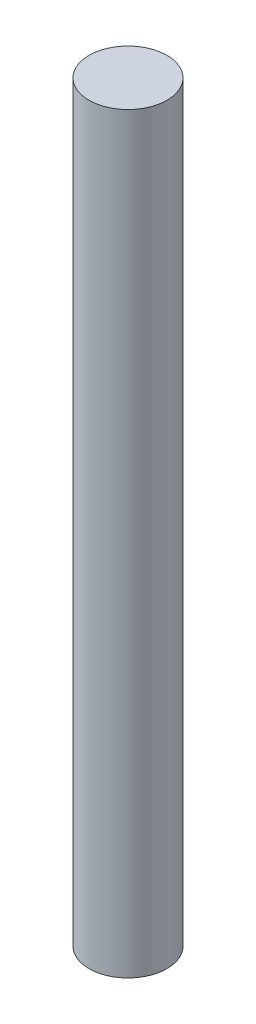
ISO-10303-21;
HEADER;
FILE_DESCRIPTION(('STEP AP214'),'2;1');
FILE_NAME('part.step','',(''),(''),'','','');
FILE_SCHEMA(('AUTOMOTIVE_DESIGN { 1 0 10303 214 1 1 1 1 }'));
ENDSEC;
DATA;
#1=APPLICATION_CONTEXT('core data for automotive mechanical design processes');
#2=APPLICATION_PROTOCOL_DEFINITION('international standard','automotive_design',2000,#1);
#3=PRODUCT_CONTEXT('',#1,'mechanical');
#4=PRODUCT('Part','Part','',(#3));
#5=PRODUCT_RELATED_PRODUCT_CATEGORY('part','',(#4));
#6=PRODUCT_DEFINITION_FORMATION('','',#4);
#7=PRODUCT_DEFINITION_CONTEXT('part definition',#1,'design');
#8=PRODUCT_DEFINITION('design','',#6,#7);
#9=PRODUCT_DEFINITION_SHAPE('','',#8);
#10=(LENGTH_UNIT() NAMED_UNIT(*) SI_UNIT(.MILLI.,.METRE.));
#11=(NAMED_UNIT(*) PLANE_ANGLE_UNIT() SI_UNIT($,.RADIAN.));
#12=(NAMED_UNIT(*) SI_UNIT($,.STERADIAN.) SOLID_ANGLE_UNIT());
#13=UNCERTAINTY_MEASURE_WITH_UNIT(LENGTH_MEASURE(1.E-05),#10,'distance_accuracy_value','');
#14=(GEOMETRIC_REPRESENTATION_CONTEXT(3) GLOBAL_UNCERTAINTY_ASSIGNED_CONTEXT((#13)) GLOBAL_UNIT_ASSIGNED_CONTEXT((#10,
#11,#12)) REPRESENTATION_CONTEXT('',''));
#15=CARTESIAN_POINT('',(0.,0.,0.));
#16=DIRECTION('',(0.,0.,1.));
#17=DIRECTION('',(1.,0.,0.));
#18=AXIS2_PLACEMENT_3D('',#15,#16,#17);
#19=CARTESIAN_POINT('',(0.,23.,0.));
#20=DIRECTION('',(0.,-1.,0.));
#21=DIRECTION('',(0.,0.,-1.));
#22=AXIS2_PLACEMENT_3D('',#19,#20,#21);
#23=CYLINDRICAL_SURFACE('',#22,1.190625);
#24=CARTESIAN_POINT('',(0.,23.,0.));
#25=DIRECTION('',(0.,1.,0.));
#26=DIRECTION('',(0.,0.,1.));
#27=AXIS2_PLACEMENT_3D('',#24,#25,#26);
#28=CIRCLE('',#27,1.190625);
#29=CARTESIAN_POINT('',(0.,23.,1.190625));
#30=VERTEX_POINT('',#29);
#31=EDGE_CURVE('E10',#30,#30,#28,.T.);
#32=ORIENTED_EDGE('',*,*,#31,.F.);
#33=EDGE_LOOP('',(#32));
#34=FACE_BOUND('',#33,.T.);
#35=CARTESIAN_POINT('',(0.,0.,0.));
#36=DIRECTION('',(0.,1.,0.));
#37=DIRECTION('',(0.,0.,1.));
#38=AXIS2_PLACEMENT_3D('',#35,#36,#37);
#39=CIRCLE('',#38,1.190625);
#40=CARTESIAN_POINT('',(0.,0.,1.190625));
#41=VERTEX_POINT('',#40);
#42=EDGE_CURVE('E38',#41,#41,#39,.T.);
#43=ORIENTED_EDGE('',*,*,#42,.T.);
#44=EDGE_LOOP('',(#43));
#45=FACE_BOUND('',#44,.T.);
#46=ADVANCED_FACE('F35',(#34,#45),#23,.T.);
#47=CARTESIAN_POINT('',(0.,23.,0.));
#48=DIRECTION('',(0.,1.,0.));
#49=DIRECTION('',(0.,0.,1.));
#50=AXIS2_PLACEMENT_3D('',#47,#48,#49);
#51=PLANE('',#50);
#52=ORIENTED_EDGE('',*,*,#31,.T.);
#53=EDGE_LOOP('',(#52));
#54=FACE_BOUND('',#53,.T.);
#55=ADVANCED_FACE('F50',(#54),#51,.T.);
#56=CARTESIAN_POINT('',(0.,0.,0.));
#57=DIRECTION('',(0.,1.,0.));
#58=DIRECTION('',(0.,0.,1.));
#59=AXIS2_PLACEMENT_3D('',#56,#57,#58);
#60=PLANE('',#59);
#61=ORIENTED_EDGE('',*,*,#42,.F.);
#62=EDGE_LOOP('',(#61));
#63=FACE_BOUND('',#62,.T.);
#64=ADVANCED_FACE('F48',(#63),#60,.F.);
#65=CLOSED_SHELL('',(#46,#55,#64));
#66=MANIFOLD_SOLID_BREP('B2',#65);
#67=ADVANCED_BREP_SHAPE_REPRESENTATION('',(#18,#66),#14);
#68=SHAPE_DEFINITION_REPRESENTATION(#9,#67);
ENDSEC;
END-ISO-10303-21;
